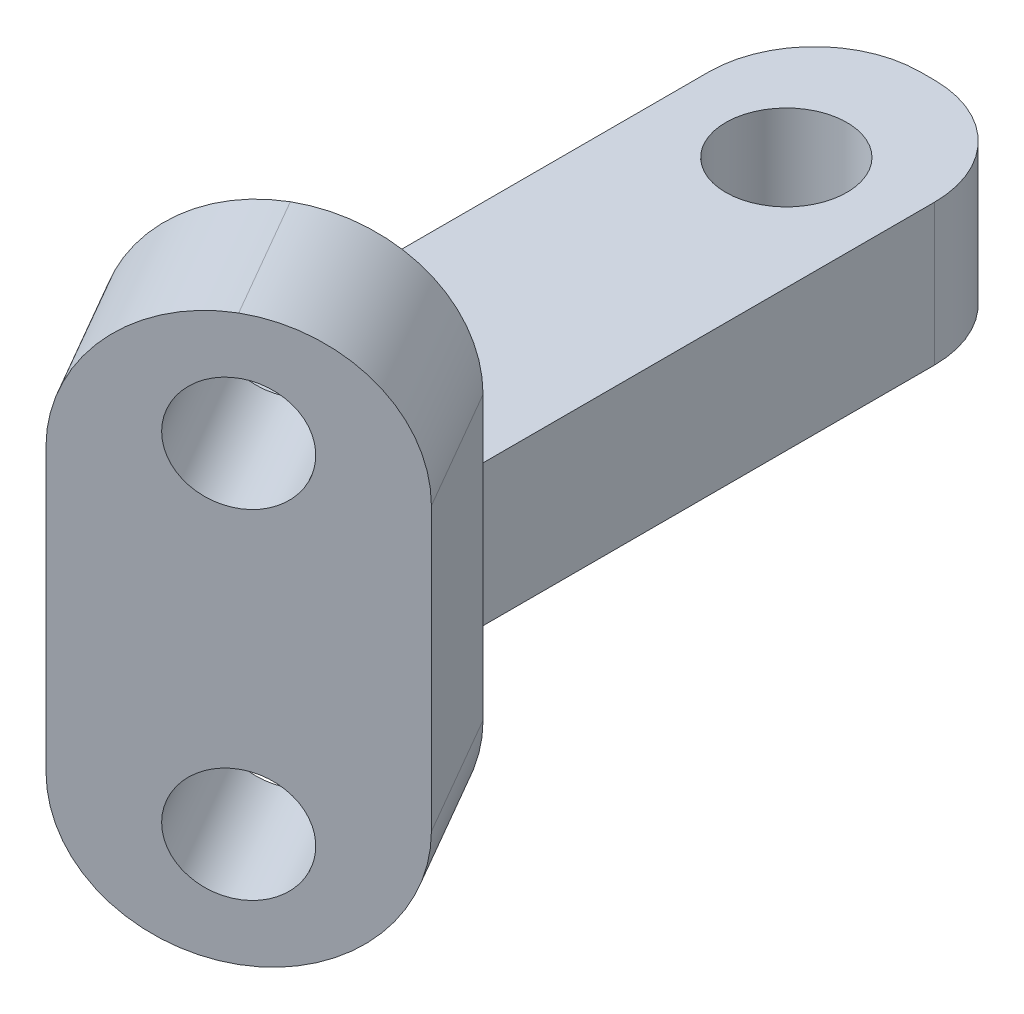
ISO-10303-21;
HEADER;
FILE_DESCRIPTION(('STEP AP214'),'2;1');
FILE_NAME('part.step','',(''),(''),'','','');
FILE_SCHEMA(('AUTOMOTIVE_DESIGN { 1 0 10303 214 1 1 1 1 }'));
ENDSEC;
DATA;
#1=APPLICATION_CONTEXT('core data for automotive mechanical design processes');
#2=APPLICATION_PROTOCOL_DEFINITION('international standard','automotive_design',2000,#1);
#3=PRODUCT_CONTEXT('',#1,'mechanical');
#4=PRODUCT('Part','Part','',(#3));
#5=PRODUCT_RELATED_PRODUCT_CATEGORY('part','',(#4));
#6=PRODUCT_DEFINITION_FORMATION('','',#4);
#7=PRODUCT_DEFINITION_CONTEXT('part definition',#1,'design');
#8=PRODUCT_DEFINITION('design','',#6,#7);
#9=PRODUCT_DEFINITION_SHAPE('','',#8);
#10=(LENGTH_UNIT() NAMED_UNIT(*) SI_UNIT(.MILLI.,.METRE.));
#11=(NAMED_UNIT(*) PLANE_ANGLE_UNIT() SI_UNIT($,.RADIAN.));
#12=(NAMED_UNIT(*) SI_UNIT($,.STERADIAN.) SOLID_ANGLE_UNIT());
#13=UNCERTAINTY_MEASURE_WITH_UNIT(LENGTH_MEASURE(1.E-05),#10,'distance_accuracy_value','');
#14=(GEOMETRIC_REPRESENTATION_CONTEXT(3) GLOBAL_UNCERTAINTY_ASSIGNED_CONTEXT((#13)) GLOBAL_UNIT_ASSIGNED_CONTEXT((#10,
#11,#12)) REPRESENTATION_CONTEXT('',''));
#15=CARTESIAN_POINT('',(0.,0.,0.));
#16=DIRECTION('',(0.,0.,1.));
#17=DIRECTION('',(1.,0.,0.));
#18=AXIS2_PLACEMENT_3D('',#15,#16,#17);
#19=CARTESIAN_POINT('',(-0.250000000000001,5.,-1.25));
#20=DIRECTION('',(0.,1.,0.));
#21=DIRECTION('',(0.,0.,1.));
#22=AXIS2_PLACEMENT_3D('',#19,#20,#21);
#23=PLANE('',#22);
#24=DIRECTION('',(0.,0.,-1.));
#25=VECTOR('',#24,1.);
#26=CARTESIAN_POINT('',(4.,5.,5.));
#27=LINE('',#26,#25);
#28=CARTESIAN_POINT('',(4.,5.,15.381197846483));
#29=VERTEX_POINT('',#28);
#30=CARTESIAN_POINT('',(4.,5.,-1.24999999999997));
#31=VERTEX_POINT('',#30);
#32=EDGE_CURVE('E149',#29,#31,#27,.T.);
#33=ORIENTED_EDGE('',*,*,#32,.T.);
#34=CARTESIAN_POINT('',(0.25,5.,-1.25));
#35=DIRECTION('',(0.,1.,0.));
#36=DIRECTION('',(0.,0.,1.));
#37=AXIS2_PLACEMENT_3D('',#34,#35,#36);
#38=CIRCLE('',#37,3.75);
#39=CARTESIAN_POINT('',(0.249999999999974,5.,-5.));
#40=VERTEX_POINT('',#39);
#41=EDGE_CURVE('E267',#31,#40,#38,.T.);
#42=ORIENTED_EDGE('',*,*,#41,.T.);
#43=DIRECTION('',(-1.,0.,0.));
#44=VECTOR('',#43,1.);
#45=CARTESIAN_POINT('',(0.249999999999973,5.,-5.));
#46=LINE('',#45,#44);
#47=CARTESIAN_POINT('',(-0.249999999999975,5.,-5.));
#48=VERTEX_POINT('',#47);
#49=EDGE_CURVE('E270',#40,#48,#46,.T.);
#50=ORIENTED_EDGE('',*,*,#49,.T.);
#51=CARTESIAN_POINT('',(-0.250000000000001,5.,-1.25));
#52=DIRECTION('',(0.,1.,0.));
#53=DIRECTION('',(0.,0.,1.));
#54=AXIS2_PLACEMENT_3D('',#51,#52,#53);
#55=CIRCLE('',#54,3.75);
#56=CARTESIAN_POINT('',(-4.,5.,-1.24999999999997));
#57=VERTEX_POINT('',#56);
#58=EDGE_CURVE('E273',#48,#57,#55,.T.);
#59=ORIENTED_EDGE('',*,*,#58,.T.);
#60=DIRECTION('',(0.,0.,1.));
#61=VECTOR('',#60,1.);
#62=CARTESIAN_POINT('',(-4.,5.,5.));
#63=LINE('',#62,#61);
#64=CARTESIAN_POINT('',(-4.,5.,20.));
#65=VERTEX_POINT('',#64);
#66=EDGE_CURVE('E276',#57,#65,#63,.T.);
#67=ORIENTED_EDGE('',*,*,#66,.T.);
#68=DIRECTION('',(0.866025403784438,0.,-0.500000000000001));
#69=VECTOR('',#68,1.);
#70=CARTESIAN_POINT('',(-4.,5.,20.));
#71=LINE('',#70,#69);
#72=EDGE_CURVE('E165',#65,#29,#71,.T.);
#73=ORIENTED_EDGE('',*,*,#72,.T.);
#74=EDGE_LOOP('',(#33,#42,#50,#59,#67,#73));
#75=FACE_BOUND('',#74,.T.);
#76=CARTESIAN_POINT('',(0.,5.,0.));
#77=DIRECTION('',(0.,1.,0.));
#78=DIRECTION('',(0.,0.,1.));
#79=AXIS2_PLACEMENT_3D('',#76,#77,#78);
#80=CIRCLE('',#79,2.14771839277839);
#81=CARTESIAN_POINT('',(0.,5.,2.14771839277839));
#82=VERTEX_POINT('',#81);
#83=EDGE_CURVE('E257',#82,#82,#80,.T.);
#84=ORIENTED_EDGE('',*,*,#83,.F.);
#85=EDGE_LOOP('',(#84));
#86=FACE_BOUND('',#85,.T.);
#87=ADVANCED_FACE('F44',(#75,#86),#23,.T.);
#88=CARTESIAN_POINT('',(-0.250000000000001,0.,-1.25));
#89=DIRECTION('',(0.,1.,0.));
#90=DIRECTION('',(0.,0.,1.));
#91=AXIS2_PLACEMENT_3D('',#88,#89,#90);
#92=PLANE('',#91);
#93=DIRECTION('',(0.,0.,-1.));
#94=VECTOR('',#93,1.);
#95=CARTESIAN_POINT('',(4.,0.,5.));
#96=LINE('',#95,#94);
#97=CARTESIAN_POINT('',(4.,0.,15.381197846483));
#98=VERTEX_POINT('',#97);
#99=CARTESIAN_POINT('',(4.,0.,-1.24999999999997));
#100=VERTEX_POINT('',#99);
#101=EDGE_CURVE('E143',#98,#100,#96,.T.);
#102=ORIENTED_EDGE('',*,*,#101,.F.);
#103=DIRECTION('',(0.866025403784438,0.,-0.500000000000001));
#104=VECTOR('',#103,1.);
#105=CARTESIAN_POINT('',(-4.,0.,20.));
#106=LINE('',#105,#104);
#107=CARTESIAN_POINT('',(-4.,0.,20.));
#108=VERTEX_POINT('',#107);
#109=EDGE_CURVE('E135',#108,#98,#106,.T.);
#110=ORIENTED_EDGE('',*,*,#109,.F.);
#111=DIRECTION('',(0.,0.,1.));
#112=VECTOR('',#111,1.);
#113=CARTESIAN_POINT('',(-4.,0.,5.));
#114=LINE('',#113,#112);
#115=CARTESIAN_POINT('',(-4.,0.,-1.24999999999997));
#116=VERTEX_POINT('',#115);
#117=EDGE_CURVE('E140',#116,#108,#114,.T.);
#118=ORIENTED_EDGE('',*,*,#117,.F.);
#119=CARTESIAN_POINT('',(-0.250000000000001,0.,-1.25));
#120=DIRECTION('',(0.,1.,0.));
#121=DIRECTION('',(0.,0.,1.));
#122=AXIS2_PLACEMENT_3D('',#119,#120,#121);
#123=CIRCLE('',#122,3.75);
#124=CARTESIAN_POINT('',(-0.249999999999975,0.,-5.));
#125=VERTEX_POINT('',#124);
#126=EDGE_CURVE('E161',#125,#116,#123,.T.);
#127=ORIENTED_EDGE('',*,*,#126,.F.);
#128=DIRECTION('',(-1.,0.,0.));
#129=VECTOR('',#128,1.);
#130=CARTESIAN_POINT('',(0.249999999999973,0.,-5.));
#131=LINE('',#130,#129);
#132=CARTESIAN_POINT('',(0.249999999999974,0.,-5.));
#133=VERTEX_POINT('',#132);
#134=EDGE_CURVE('E286',#133,#125,#131,.T.);
#135=ORIENTED_EDGE('',*,*,#134,.F.);
#136=CARTESIAN_POINT('',(0.25,0.,-1.25));
#137=DIRECTION('',(0.,1.,0.));
#138=DIRECTION('',(0.,0.,1.));
#139=AXIS2_PLACEMENT_3D('',#136,#137,#138);
#140=CIRCLE('',#139,3.75);
#141=EDGE_CURVE('E283',#100,#133,#140,.T.);
#142=ORIENTED_EDGE('',*,*,#141,.F.);
#143=EDGE_LOOP('',(#102,#110,#118,#127,#135,#142));
#144=FACE_BOUND('',#143,.T.);
#145=CARTESIAN_POINT('',(0.,0.,0.));
#146=DIRECTION('',(0.,1.,0.));
#147=DIRECTION('',(0.,0.,1.));
#148=AXIS2_PLACEMENT_3D('',#145,#146,#147);
#149=CIRCLE('',#148,2.14771839277839);
#150=CARTESIAN_POINT('',(0.,0.,2.14771839277839));
#151=VERTEX_POINT('',#150);
#152=EDGE_CURVE('E261',#151,#151,#149,.T.);
#153=ORIENTED_EDGE('',*,*,#152,.T.);
#154=EDGE_LOOP('',(#153));
#155=FACE_BOUND('',#154,.T.);
#156=ADVANCED_FACE('F137',(#144,#155),#92,.F.);
#157=CARTESIAN_POINT('',(4.,5.,5.));
#158=DIRECTION('',(-1.,0.,0.));
#159=DIRECTION('',(0.,0.,1.));
#160=AXIS2_PLACEMENT_3D('',#157,#158,#159);
#161=PLANE('',#160);
#162=ORIENTED_EDGE('',*,*,#101,.T.);
#163=DIRECTION('',(0.,-1.,0.));
#164=VECTOR('',#163,1.);
#165=CARTESIAN_POINT('',(4.,5.,-1.24999999999997));
#166=LINE('',#165,#164);
#167=EDGE_CURVE('E182',#31,#100,#166,.T.);
#168=ORIENTED_EDGE('',*,*,#167,.F.);
#169=ORIENTED_EDGE('',*,*,#32,.F.);
#170=DIRECTION('',(0.,-1.,0.));
#171=VECTOR('',#170,1.);
#172=CARTESIAN_POINT('',(4.,5.,15.381197846483));
#173=LINE('',#172,#171);
#174=EDGE_CURVE('E167',#29,#98,#173,.T.);
#175=ORIENTED_EDGE('',*,*,#174,.T.);
#176=EDGE_LOOP('',(#162,#168,#169,#175));
#177=FACE_BOUND('',#176,.T.);
#178=ADVANCED_FACE('F305',(#177),#161,.F.);
#179=CARTESIAN_POINT('',(0.25,5.,-1.25));
#180=DIRECTION('',(0.,-1.,0.));
#181=DIRECTION('',(0.,0.,-1.));
#182=AXIS2_PLACEMENT_3D('',#179,#180,#181);
#183=CYLINDRICAL_SURFACE('',#182,3.75);
#184=ORIENTED_EDGE('',*,*,#141,.T.);
#185=DIRECTION('',(0.,-1.,0.));
#186=VECTOR('',#185,1.);
#187=CARTESIAN_POINT('',(0.249999999999974,5.,-5.));
#188=LINE('',#187,#186);
#189=EDGE_CURVE('E178',#40,#133,#188,.T.);
#190=ORIENTED_EDGE('',*,*,#189,.F.);
#191=ORIENTED_EDGE('',*,*,#41,.F.);
#192=ORIENTED_EDGE('',*,*,#167,.T.);
#193=EDGE_LOOP('',(#184,#190,#191,#192));
#194=FACE_BOUND('',#193,.T.);
#195=ADVANCED_FACE('F301',(#194),#183,.T.);
#196=CARTESIAN_POINT('',(0.249999999999973,5.,-5.));
#197=DIRECTION('',(0.,0.,1.));
#198=DIRECTION('',(1.,0.,0.));
#199=AXIS2_PLACEMENT_3D('',#196,#197,#198);
#200=PLANE('',#199);
#201=ORIENTED_EDGE('',*,*,#134,.T.);
#202=DIRECTION('',(0.,-1.,0.));
#203=VECTOR('',#202,1.);
#204=CARTESIAN_POINT('',(-0.249999999999975,5.,-5.));
#205=LINE('',#204,#203);
#206=EDGE_CURVE('E171',#48,#125,#205,.T.);
#207=ORIENTED_EDGE('',*,*,#206,.F.);
#208=ORIENTED_EDGE('',*,*,#49,.F.);
#209=ORIENTED_EDGE('',*,*,#189,.T.);
#210=EDGE_LOOP('',(#201,#207,#208,#209));
#211=FACE_BOUND('',#210,.T.);
#212=ADVANCED_FACE('F296',(#211),#200,.F.);
#213=CARTESIAN_POINT('',(-0.250000000000001,5.,-1.25));
#214=DIRECTION('',(0.,-1.,0.));
#215=DIRECTION('',(0.,0.,-1.));
#216=AXIS2_PLACEMENT_3D('',#213,#214,#215);
#217=CYLINDRICAL_SURFACE('',#216,3.75);
#218=ORIENTED_EDGE('',*,*,#126,.T.);
#219=DIRECTION('',(0.,-1.,0.));
#220=VECTOR('',#219,1.);
#221=CARTESIAN_POINT('',(-4.,5.,-1.24999999999997));
#222=LINE('',#221,#220);
#223=EDGE_CURVE('E159',#57,#116,#222,.T.);
#224=ORIENTED_EDGE('',*,*,#223,.F.);
#225=ORIENTED_EDGE('',*,*,#58,.F.);
#226=ORIENTED_EDGE('',*,*,#206,.T.);
#227=EDGE_LOOP('',(#218,#224,#225,#226));
#228=FACE_BOUND('',#227,.T.);
#229=ADVANCED_FACE('F291',(#228),#217,.T.);
#230=CARTESIAN_POINT('',(-4.,5.,5.));
#231=DIRECTION('',(1.,0.,0.));
#232=DIRECTION('',(0.,0.,-1.));
#233=AXIS2_PLACEMENT_3D('',#230,#231,#232);
#234=PLANE('',#233);
#235=ORIENTED_EDGE('',*,*,#117,.T.);
#236=DIRECTION('',(0.,-1.,0.));
#237=VECTOR('',#236,1.);
#238=CARTESIAN_POINT('',(-4.,5.,20.));
#239=LINE('',#238,#237);
#240=EDGE_CURVE('E156',#65,#108,#239,.T.);
#241=ORIENTED_EDGE('',*,*,#240,.F.);
#242=ORIENTED_EDGE('',*,*,#66,.F.);
#243=ORIENTED_EDGE('',*,*,#223,.T.);
#244=EDGE_LOOP('',(#235,#241,#242,#243));
#245=FACE_BOUND('',#244,.T.);
#246=ADVANCED_FACE('F154',(#245),#234,.F.);
#247=CARTESIAN_POINT('',(0.,5.,0.));
#248=DIRECTION('',(0.,-1.,0.));
#249=DIRECTION('',(0.,0.,-1.));
#250=AXIS2_PLACEMENT_3D('',#247,#248,#249);
#251=CYLINDRICAL_SURFACE('',#250,2.14771839277839);
#252=ORIENTED_EDGE('',*,*,#83,.T.);
#253=EDGE_LOOP('',(#252));
#254=FACE_BOUND('',#253,.T.);
#255=ORIENTED_EDGE('',*,*,#152,.F.);
#256=EDGE_LOOP('',(#255));
#257=FACE_BOUND('',#256,.T.);
#258=ADVANCED_FACE('F312',(#254,#257),#251,.F.);
#259=CARTESIAN_POINT('',(6.90044641670906,12.5,19.4801270189222));
#260=DIRECTION('',(-0.866025403784438,0.,0.500000000000001));
#261=DIRECTION('',(0.500000000000001,0.,0.866025403784438));
#262=AXIS2_PLACEMENT_3D('',#259,#260,#261);
#263=PLANE('',#262);
#264=DIRECTION('',(0.,1.,0.));
#265=VECTOR('',#264,1.);
#266=CARTESIAN_POINT('',(4.40044641670905,12.5,15.15));
#267=LINE('',#266,#265);
#268=CARTESIAN_POINT('',(4.40044641670905,-2.5,15.15));
#269=VERTEX_POINT('',#268);
#270=CARTESIAN_POINT('',(4.40044641670905,7.5,15.15));
#271=VERTEX_POINT('',#270);
#272=EDGE_CURVE('E245',#269,#271,#267,.T.);
#273=ORIENTED_EDGE('',*,*,#272,.T.);
#274=DIRECTION('',(-0.500000000000001,0.,-0.866025403784438));
#275=VECTOR('',#274,1.);
#276=CARTESIAN_POINT('',(6.90044641670906,7.5,19.4801270189222));
#277=LINE('',#276,#275);
#278=CARTESIAN_POINT('',(6.90044641670906,7.5,19.4801270189222));
#279=VERTEX_POINT('',#278);
#280=EDGE_CURVE('E202',#271,#279,#277,.F.);
#281=ORIENTED_EDGE('',*,*,#280,.T.);
#282=DIRECTION('',(0.,1.,0.));
#283=VECTOR('',#282,1.);
#284=CARTESIAN_POINT('',(6.90044641670906,12.5,19.4801270189222));
#285=LINE('',#284,#283);
#286=CARTESIAN_POINT('',(6.90044641670906,-2.5,19.4801270189222));
#287=VERTEX_POINT('',#286);
#288=EDGE_CURVE('E244',#287,#279,#285,.T.);
#289=ORIENTED_EDGE('',*,*,#288,.F.);
#290=DIRECTION('',(-0.500000000000001,0.,-0.866025403784438));
#291=VECTOR('',#290,1.);
#292=CARTESIAN_POINT('',(6.90044641670906,-2.5,19.4801270189222));
#293=LINE('',#292,#291);
#294=EDGE_CURVE('E198',#287,#269,#293,.T.);
#295=ORIENTED_EDGE('',*,*,#294,.T.);
#296=EDGE_LOOP('',(#273,#281,#289,#295));
#297=FACE_BOUND('',#296,.T.);
#298=ADVANCED_FACE('F315',(#297),#263,.F.);
#299=CARTESIAN_POINT('',(-1.75980762113532,12.5,24.4801270189222));
#300=DIRECTION('',(0.866025403784438,0.,-0.500000000000001));
#301=DIRECTION('',(-0.500000000000001,0.,-0.866025403784438));
#302=AXIS2_PLACEMENT_3D('',#299,#300,#301);
#303=PLANE('',#302);
#304=DIRECTION('',(0.,-1.,0.));
#305=VECTOR('',#304,1.);
#306=CARTESIAN_POINT('',(-1.75980762113532,12.5,24.4801270189222));
#307=LINE('',#306,#305);
#308=CARTESIAN_POINT('',(-1.75980762113532,7.5,24.4801270189222));
#309=VERTEX_POINT('',#308);
#310=CARTESIAN_POINT('',(-1.75980762113532,-2.5,24.4801270189222));
#311=VERTEX_POINT('',#310);
#312=EDGE_CURVE('E250',#309,#311,#307,.T.);
#313=ORIENTED_EDGE('',*,*,#312,.F.);
#314=DIRECTION('',(-0.500000000000001,0.,-0.866025403784438));
#315=VECTOR('',#314,1.);
#316=CARTESIAN_POINT('',(-1.75980762113532,7.5,24.4801270189222));
#317=LINE('',#316,#315);
#318=CARTESIAN_POINT('',(-4.25980762113532,7.5,20.15));
#319=VERTEX_POINT('',#318);
#320=EDGE_CURVE('E11',#309,#319,#317,.T.);
#321=ORIENTED_EDGE('',*,*,#320,.T.);
#322=DIRECTION('',(0.,-1.,0.));
#323=VECTOR('',#322,1.);
#324=CARTESIAN_POINT('',(-4.25980762113532,12.5,20.15));
#325=LINE('',#324,#323);
#326=CARTESIAN_POINT('',(-4.25980762113533,-2.5,20.15));
#327=VERTEX_POINT('',#326);
#328=EDGE_CURVE('E238',#319,#327,#325,.T.);
#329=ORIENTED_EDGE('',*,*,#328,.T.);
#330=DIRECTION('',(-0.500000000000001,0.,-0.866025403784438));
#331=VECTOR('',#330,1.);
#332=CARTESIAN_POINT('',(-1.75980762113532,-2.5,24.4801270189222));
#333=LINE('',#332,#331);
#334=EDGE_CURVE('E54',#327,#311,#333,.F.);
#335=ORIENTED_EDGE('',*,*,#334,.T.);
#336=EDGE_LOOP('',(#313,#321,#329,#335));
#337=FACE_BOUND('',#336,.T.);
#338=ADVANCED_FACE('F241',(#337),#303,.F.);
#339=CARTESIAN_POINT('',(10.1602540378444,0.,17.5980762113533));
#340=DIRECTION('',(-0.500000000000001,0.,-0.866025403784438));
#341=DIRECTION('',(-0.866025403784438,0.,0.500000000000001));
#342=AXIS2_PLACEMENT_3D('',#339,#340,#341);
#343=PLANE('',#342);
#344=CARTESIAN_POINT('',(2.57031939778688,-3.5,21.9801270189222));
#345=DIRECTION('',(-0.500000000000001,0.,-0.866025403784438));
#346=DIRECTION('',(-0.866025403784438,0.,0.500000000000001));
#347=AXIS2_PLACEMENT_3D('',#344,#345,#346);
#348=CIRCLE('',#347,2.);
#349=CARTESIAN_POINT('',(0.838268590218001,-3.5,22.9801270189222));
#350=VERTEX_POINT('',#349);
#351=EDGE_CURVE('E253',#350,#350,#348,.T.);
#352=ORIENTED_EDGE('',*,*,#351,.T.);
#353=EDGE_LOOP('',(#352));
#354=FACE_BOUND('',#353,.T.);
#355=CARTESIAN_POINT('',(2.57031939778687,8.5,21.9801270189222));
#356=DIRECTION('',(-0.500000000000001,0.,-0.866025403784438));
#357=DIRECTION('',(-0.866025403784438,0.,0.500000000000001));
#358=AXIS2_PLACEMENT_3D('',#355,#356,#357);
#359=CIRCLE('',#358,2.);
#360=CARTESIAN_POINT('',(0.838268590217997,8.5,22.9801270189222));
#361=VERTEX_POINT('',#360);
#362=EDGE_CURVE('E221',#361,#361,#359,.T.);
#363=ORIENTED_EDGE('',*,*,#362,.T.);
#364=EDGE_LOOP('',(#363));
#365=FACE_BOUND('',#364,.T.);
#366=ORIENTED_EDGE('',*,*,#288,.T.);
#367=CARTESIAN_POINT('',(2.57031939778687,7.5,21.9801270189222));
#368=DIRECTION('',(-0.500000000000001,0.,-0.866025403784438));
#369=DIRECTION('',(-0.866025403784438,0.,0.500000000000001));
#370=AXIS2_PLACEMENT_3D('',#367,#368,#369);
#371=CIRCLE('',#370,5.);
#372=CARTESIAN_POINT('',(2.57031939778687,12.5,21.9801270189222));
#373=VERTEX_POINT('',#372);
#374=EDGE_CURVE('E214',#279,#373,#371,.F.);
#375=ORIENTED_EDGE('',*,*,#374,.T.);
#376=CARTESIAN_POINT('',(2.57031939778687,7.5,21.9801270189222));
#377=DIRECTION('',(-0.500000000000001,0.,-0.866025403784438));
#378=DIRECTION('',(-0.866025403784438,0.,0.500000000000001));
#379=AXIS2_PLACEMENT_3D('',#376,#377,#378);
#380=CIRCLE('',#379,5.);
#381=EDGE_CURVE('E211',#373,#309,#380,.F.);
#382=ORIENTED_EDGE('',*,*,#381,.T.);
#383=ORIENTED_EDGE('',*,*,#312,.T.);
#384=CARTESIAN_POINT('',(2.57031939778687,-2.5,21.9801270189222));
#385=DIRECTION('',(-0.500000000000001,0.,-0.866025403784438));
#386=DIRECTION('',(-0.866025403784438,0.,0.500000000000001));
#387=AXIS2_PLACEMENT_3D('',#384,#385,#386);
#388=CIRCLE('',#387,5.);
#389=CARTESIAN_POINT('',(2.57031939778687,-7.5,21.9801270189222));
#390=VERTEX_POINT('',#389);
#391=EDGE_CURVE('E62',#311,#390,#388,.F.);
#392=ORIENTED_EDGE('',*,*,#391,.T.);
#393=CARTESIAN_POINT('',(2.57031939778687,-2.5,21.9801270189222));
#394=DIRECTION('',(-0.500000000000001,0.,-0.866025403784438));
#395=DIRECTION('',(-0.866025403784438,0.,0.500000000000001));
#396=AXIS2_PLACEMENT_3D('',#393,#394,#395);
#397=CIRCLE('',#396,5.);
#398=EDGE_CURVE('E208',#390,#287,#397,.F.);
#399=ORIENTED_EDGE('',*,*,#398,.T.);
#400=EDGE_LOOP('',(#366,#375,#382,#383,#392,#399));
#401=FACE_BOUND('',#400,.T.);
#402=ADVANCED_FACE('F365',(#354,#365,#401),#343,.F.);
#403=CARTESIAN_POINT('',(7.6602540378444,0.,13.2679491924311));
#404=DIRECTION('',(-0.500000000000001,0.,-0.866025403784438));
#405=DIRECTION('',(-0.866025403784438,0.,0.500000000000001));
#406=AXIS2_PLACEMENT_3D('',#403,#404,#405);
#407=PLANE('',#406);
#408=CARTESIAN_POINT('',(0.0703193977868713,-3.5,17.65));
#409=DIRECTION('',(-0.500000000000001,0.,-0.866025403784438));
#410=DIRECTION('',(-0.866025403784438,0.,0.500000000000001));
#411=AXIS2_PLACEMENT_3D('',#408,#409,#410);
#412=CIRCLE('',#411,2.);
#413=CARTESIAN_POINT('',(-1.661731409782,-3.5,18.65));
#414=VERTEX_POINT('',#413);
#415=EDGE_CURVE('E479',#414,#414,#412,.T.);
#416=ORIENTED_EDGE('',*,*,#415,.F.);
#417=EDGE_LOOP('',(#416));
#418=FACE_BOUND('',#417,.T.);
#419=CARTESIAN_POINT('',(0.0703193977868678,8.5,17.65));
#420=DIRECTION('',(-0.500000000000001,0.,-0.866025403784438));
#421=DIRECTION('',(-0.866025403784438,0.,0.500000000000001));
#422=AXIS2_PLACEMENT_3D('',#419,#420,#421);
#423=CIRCLE('',#422,2.);
#424=CARTESIAN_POINT('',(-1.66173140978201,8.5,18.65));
#425=VERTEX_POINT('',#424);
#426=EDGE_CURVE('E228',#425,#425,#423,.T.);
#427=ORIENTED_EDGE('',*,*,#426,.F.);
#428=EDGE_LOOP('',(#427));
#429=FACE_BOUND('',#428,.T.);
#430=ORIENTED_EDGE('',*,*,#240,.T.);
#431=ORIENTED_EDGE('',*,*,#109,.T.);
#432=ORIENTED_EDGE('',*,*,#174,.F.);
#433=ORIENTED_EDGE('',*,*,#72,.F.);
#434=EDGE_LOOP('',(#430,#431,#432,#433));
#435=FACE_BOUND('',#434,.T.);
#436=CARTESIAN_POINT('',(0.0703193977868687,7.5,17.65));
#437=DIRECTION('',(-0.500000000000001,0.,-0.866025403784438));
#438=DIRECTION('',(-0.866025403784438,0.,0.500000000000001));
#439=AXIS2_PLACEMENT_3D('',#436,#437,#438);
#440=CIRCLE('',#439,5.);
#441=CARTESIAN_POINT('',(0.0703193977868652,12.5,17.65));
#442=VERTEX_POINT('',#441);
#443=EDGE_CURVE('E192',#319,#442,#440,.T.);
#444=ORIENTED_EDGE('',*,*,#443,.T.);
#445=CARTESIAN_POINT('',(0.070319397786863,7.5,17.65));
#446=DIRECTION('',(-0.500000000000001,0.,-0.866025403784438));
#447=DIRECTION('',(-0.866025403784438,0.,0.500000000000001));
#448=AXIS2_PLACEMENT_3D('',#445,#446,#447);
#449=CIRCLE('',#448,5.);
#450=EDGE_CURVE('E195',#442,#271,#449,.T.);
#451=ORIENTED_EDGE('',*,*,#450,.T.);
#452=ORIENTED_EDGE('',*,*,#272,.F.);
#453=CARTESIAN_POINT('',(0.0703193977868643,-2.5,17.65));
#454=DIRECTION('',(-0.500000000000001,0.,-0.866025403784438));
#455=DIRECTION('',(-0.866025403784438,0.,0.500000000000001));
#456=AXIS2_PLACEMENT_3D('',#453,#454,#455);
#457=CIRCLE('',#456,5.);
#458=CARTESIAN_POINT('',(0.0703193977868678,-7.5,17.65));
#459=VERTEX_POINT('',#458);
#460=EDGE_CURVE('E189',#269,#459,#457,.T.);
#461=ORIENTED_EDGE('',*,*,#460,.T.);
#462=CARTESIAN_POINT('',(0.0703193977868682,-2.5,17.65));
#463=DIRECTION('',(-0.500000000000001,0.,-0.866025403784438));
#464=DIRECTION('',(-0.866025403784438,0.,0.500000000000001));
#465=AXIS2_PLACEMENT_3D('',#462,#463,#464);
#466=CIRCLE('',#465,5.);
#467=EDGE_CURVE('E186',#459,#327,#466,.T.);
#468=ORIENTED_EDGE('',*,*,#467,.T.);
#469=ORIENTED_EDGE('',*,*,#328,.F.);
#470=EDGE_LOOP('',(#444,#451,#452,#461,#468,#469));
#471=FACE_BOUND('',#470,.T.);
#472=ADVANCED_FACE('F163',(#418,#429,#435,#471),#407,.T.);
#473=CARTESIAN_POINT('',(2.57031939778687,8.5,21.9801270189222));
#474=DIRECTION('',(-0.500000000000001,0.,-0.866025403784438));
#475=DIRECTION('',(-0.866025403784438,0.,0.500000000000001));
#476=AXIS2_PLACEMENT_3D('',#473,#474,#475);
#477=CYLINDRICAL_SURFACE('',#476,2.);
#478=ORIENTED_EDGE('',*,*,#362,.F.);
#479=EDGE_LOOP('',(#478));
#480=FACE_BOUND('',#479,.T.);
#481=ORIENTED_EDGE('',*,*,#426,.T.);
#482=EDGE_LOOP('',(#481));
#483=FACE_BOUND('',#482,.T.);
#484=ADVANCED_FACE('F364',(#480,#483),#477,.F.);
#485=CARTESIAN_POINT('',(2.57031939778688,-3.5,21.9801270189222));
#486=DIRECTION('',(-0.500000000000001,0.,-0.866025403784438));
#487=DIRECTION('',(-0.866025403784438,0.,0.500000000000001));
#488=AXIS2_PLACEMENT_3D('',#485,#486,#487);
#489=CYLINDRICAL_SURFACE('',#488,2.);
#490=ORIENTED_EDGE('',*,*,#351,.F.);
#491=EDGE_LOOP('',(#490));
#492=FACE_BOUND('',#491,.T.);
#493=ORIENTED_EDGE('',*,*,#415,.T.);
#494=EDGE_LOOP('',(#493));
#495=FACE_BOUND('',#494,.T.);
#496=ADVANCED_FACE('F338',(#492,#495),#489,.F.);
#497=CARTESIAN_POINT('',(2.57031939778687,7.5,21.9801270189222));
#498=DIRECTION('',(-0.500000000000001,0.,-0.866025403784438));
#499=DIRECTION('',(-0.866025403784438,0.,0.500000000000001));
#500=AXIS2_PLACEMENT_3D('',#497,#498,#499);
#501=CYLINDRICAL_SURFACE('',#500,5.);
#502=ORIENTED_EDGE('',*,*,#320,.F.);
#503=ORIENTED_EDGE('',*,*,#381,.F.);
#504=DIRECTION('',(-0.500000000000001,0.,-0.866025403784438));
#505=VECTOR('',#504,1.);
#506=CARTESIAN_POINT('',(2.57031939778687,12.5,21.9801270189222));
#507=LINE('',#506,#505);
#508=EDGE_CURVE('E218',#442,#373,#507,.F.);
#509=ORIENTED_EDGE('',*,*,#508,.F.);
#510=ORIENTED_EDGE('',*,*,#443,.F.);
#511=EDGE_LOOP('',(#502,#503,#509,#510));
#512=FACE_BOUND('',#511,.T.);
#513=ADVANCED_FACE('F336',(#512),#501,.T.);
#514=CARTESIAN_POINT('',(2.57031939778686,7.5,21.9801270189222));
#515=DIRECTION('',(-0.500000000000001,0.,-0.866025403784438));
#516=DIRECTION('',(-0.866025403784438,0.,0.500000000000001));
#517=AXIS2_PLACEMENT_3D('',#514,#515,#516);
#518=CYLINDRICAL_SURFACE('',#517,5.);
#519=ORIENTED_EDGE('',*,*,#374,.F.);
#520=ORIENTED_EDGE('',*,*,#280,.F.);
#521=ORIENTED_EDGE('',*,*,#450,.F.);
#522=ORIENTED_EDGE('',*,*,#508,.T.);
#523=EDGE_LOOP('',(#519,#520,#521,#522));
#524=FACE_BOUND('',#523,.T.);
#525=ADVANCED_FACE('F333',(#524),#518,.T.);
#526=CARTESIAN_POINT('',(2.57031939778687,-2.5,21.9801270189222));
#527=DIRECTION('',(-0.500000000000001,0.,-0.866025403784438));
#528=DIRECTION('',(-0.866025403784438,0.,0.500000000000001));
#529=AXIS2_PLACEMENT_3D('',#526,#527,#528);
#530=CYLINDRICAL_SURFACE('',#529,5.);
#531=DIRECTION('',(-0.500000000000001,0.,-0.866025403784438));
#532=VECTOR('',#531,1.);
#533=CARTESIAN_POINT('',(2.57031939778687,-7.5,21.9801270189222));
#534=LINE('',#533,#532);
#535=EDGE_CURVE('E48',#390,#459,#534,.T.);
#536=ORIENTED_EDGE('',*,*,#535,.F.);
#537=ORIENTED_EDGE('',*,*,#391,.F.);
#538=ORIENTED_EDGE('',*,*,#334,.F.);
#539=ORIENTED_EDGE('',*,*,#467,.F.);
#540=EDGE_LOOP('',(#536,#537,#538,#539));
#541=FACE_BOUND('',#540,.T.);
#542=ADVANCED_FACE('F46',(#541),#530,.T.);
#543=CARTESIAN_POINT('',(2.57031939778687,-2.5,21.9801270189222));
#544=DIRECTION('',(-0.500000000000001,0.,-0.866025403784438));
#545=DIRECTION('',(-0.866025403784438,0.,0.500000000000001));
#546=AXIS2_PLACEMENT_3D('',#543,#544,#545);
#547=CYLINDRICAL_SURFACE('',#546,5.);
#548=ORIENTED_EDGE('',*,*,#398,.F.);
#549=ORIENTED_EDGE('',*,*,#535,.T.);
#550=ORIENTED_EDGE('',*,*,#460,.F.);
#551=ORIENTED_EDGE('',*,*,#294,.F.);
#552=EDGE_LOOP('',(#548,#549,#550,#551));
#553=FACE_BOUND('',#552,.T.);
#554=ADVANCED_FACE('F233',(#553),#547,.T.);
#555=CLOSED_SHELL('',(#87,#156,#178,#195,#212,#229,#246,#258,#298,#338,#402,#472,#484,#496,#513,
#525,#542,#554));
#556=MANIFOLD_SOLID_BREP('B2',#555);
#557=ADVANCED_BREP_SHAPE_REPRESENTATION('',(#18,#556),#14);
#558=SHAPE_DEFINITION_REPRESENTATION(#9,#557);
ENDSEC;
END-ISO-10303-21;
